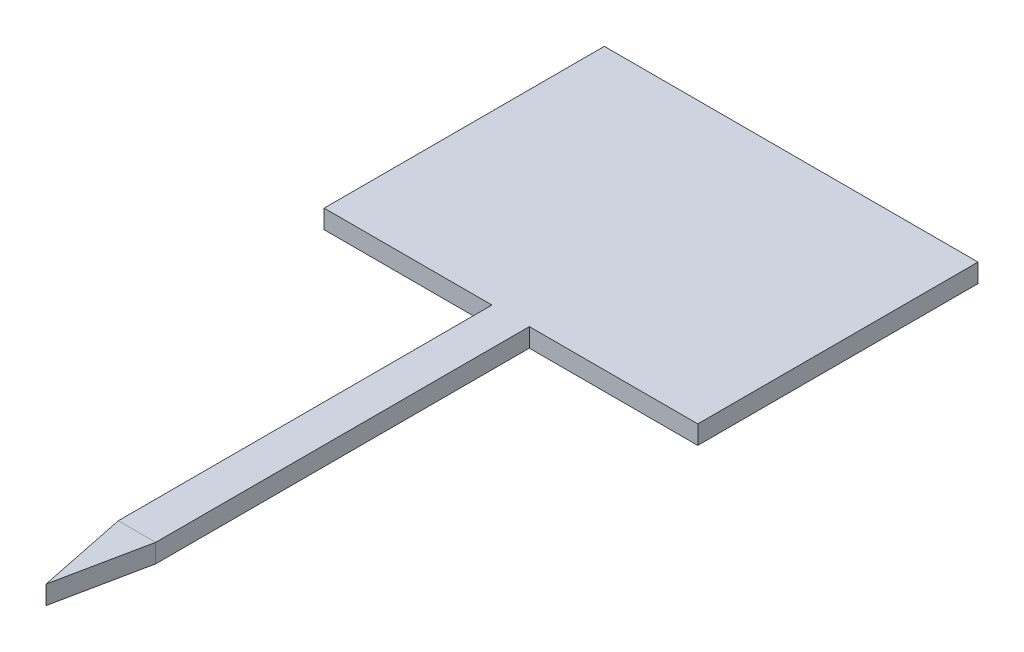
ISO-10303-21;
HEADER;
FILE_DESCRIPTION(('STEP AP214'),'2;1');
FILE_NAME('part.step','',(''),(''),'','','');
FILE_SCHEMA(('AUTOMOTIVE_DESIGN { 1 0 10303 214 1 1 1 1 }'));
ENDSEC;
DATA;
#1=APPLICATION_CONTEXT('core data for automotive mechanical design processes');
#2=APPLICATION_PROTOCOL_DEFINITION('international standard','automotive_design',2000,#1);
#3=PRODUCT_CONTEXT('',#1,'mechanical');
#4=PRODUCT('Part','Part','',(#3));
#5=PRODUCT_RELATED_PRODUCT_CATEGORY('part','',(#4));
#6=PRODUCT_DEFINITION_FORMATION('','',#4);
#7=PRODUCT_DEFINITION_CONTEXT('part definition',#1,'design');
#8=PRODUCT_DEFINITION('design','',#6,#7);
#9=PRODUCT_DEFINITION_SHAPE('','',#8);
#10=(LENGTH_UNIT() NAMED_UNIT(*) SI_UNIT(.MILLI.,.METRE.));
#11=(NAMED_UNIT(*) PLANE_ANGLE_UNIT() SI_UNIT($,.RADIAN.));
#12=(NAMED_UNIT(*) SI_UNIT($,.STERADIAN.) SOLID_ANGLE_UNIT());
#13=UNCERTAINTY_MEASURE_WITH_UNIT(LENGTH_MEASURE(1.E-05),#10,'distance_accuracy_value','');
#14=(GEOMETRIC_REPRESENTATION_CONTEXT(3) GLOBAL_UNCERTAINTY_ASSIGNED_CONTEXT((#13)) GLOBAL_UNIT_ASSIGNED_CONTEXT((#10,
#11,#12)) REPRESENTATION_CONTEXT('',''));
#15=CARTESIAN_POINT('',(0.,0.,0.));
#16=DIRECTION('',(0.,0.,1.));
#17=DIRECTION('',(1.,0.,0.));
#18=AXIS2_PLACEMENT_3D('',#15,#16,#17);
#19=CARTESIAN_POINT('',(3.576311416631,0.2,0.));
#20=DIRECTION('',(1.,0.,0.));
#21=DIRECTION('',(0.,0.,-1.));
#22=AXIS2_PLACEMENT_3D('',#19,#20,#21);
#23=PLANE('',#22);
#24=DIRECTION('',(0.,0.,1.));
#25=VECTOR('',#24,1.);
#26=CARTESIAN_POINT('',(3.576311416631,0.,0.));
#27=LINE('',#26,#25);
#28=CARTESIAN_POINT('',(3.576311416631,0.,-0.67866655363602));
#29=VERTEX_POINT('',#28);
#30=CARTESIAN_POINT('',(3.576311416631,0.,3.32133344636398));
#31=VERTEX_POINT('',#30);
#32=EDGE_CURVE('E171',#29,#31,#27,.T.);
#33=ORIENTED_EDGE('',*,*,#32,.F.);
#34=DIRECTION('',(0.,-1.,0.));
#35=VECTOR('',#34,1.);
#36=CARTESIAN_POINT('',(3.576311416631,0.2,-0.67866655363602));
#37=LINE('',#36,#35);
#38=CARTESIAN_POINT('',(3.576311416631,0.2,-0.67866655363602));
#39=VERTEX_POINT('',#38);
#40=EDGE_CURVE('E11',#39,#29,#37,.T.);
#41=ORIENTED_EDGE('',*,*,#40,.F.);
#42=DIRECTION('',(0.,0.,1.));
#43=VECTOR('',#42,1.);
#44=CARTESIAN_POINT('',(3.576311416631,0.2,0.));
#45=LINE('',#44,#43);
#46=CARTESIAN_POINT('',(3.576311416631,0.200006,3.32133344636398));
#47=VERTEX_POINT('',#46);
#48=EDGE_CURVE('E142',#39,#47,#45,.T.);
#49=ORIENTED_EDGE('',*,*,#48,.T.);
#50=DIRECTION('',(0.,-1.,0.));
#51=VECTOR('',#50,1.);
#52=CARTESIAN_POINT('',(3.576311416631,0.2,3.32133344636398));
#53=LINE('',#52,#51);
#54=EDGE_CURVE('E86',#47,#31,#53,.T.);
#55=ORIENTED_EDGE('',*,*,#54,.T.);
#56=EDGE_LOOP('',(#33,#41,#49,#55));
#57=FACE_BOUND('',#56,.T.);
#58=ADVANCED_FACE('F34',(#57),#23,.T.);
#59=CARTESIAN_POINT('',(0.,0.2,-0.67866655363602));
#60=DIRECTION('',(0.,0.,-1.));
#61=DIRECTION('',(-1.,0.,0.));
#62=AXIS2_PLACEMENT_3D('',#59,#60,#61);
#63=PLANE('',#62);
#64=DIRECTION('',(1.,0.,0.));
#65=VECTOR('',#64,1.);
#66=CARTESIAN_POINT('',(0.,0.,-0.67866655363602));
#67=LINE('',#66,#65);
#68=CARTESIAN_POINT('',(5.37970182258057,0.,-0.67866655363602));
#69=VERTEX_POINT('',#68);
#70=EDGE_CURVE('E148',#29,#69,#67,.T.);
#71=ORIENTED_EDGE('',*,*,#70,.T.);
#72=DIRECTION('',(0.,-1.,0.));
#73=VECTOR('',#72,1.);
#74=CARTESIAN_POINT('',(5.37970182258057,0.2,-0.67866655363602));
#75=LINE('',#74,#73);
#76=CARTESIAN_POINT('',(5.37970182258057,0.2,-0.67866655363602));
#77=VERTEX_POINT('',#76);
#78=EDGE_CURVE('E43',#77,#69,#75,.T.);
#79=ORIENTED_EDGE('',*,*,#78,.F.);
#80=DIRECTION('',(1.,0.,0.));
#81=VECTOR('',#80,1.);
#82=CARTESIAN_POINT('',(0.,0.2,-0.67866655363602));
#83=LINE('',#82,#81);
#84=EDGE_CURVE('E118',#39,#77,#83,.T.);
#85=ORIENTED_EDGE('',*,*,#84,.F.);
#86=ORIENTED_EDGE('',*,*,#40,.T.);
#87=EDGE_LOOP('',(#71,#79,#85,#86));
#88=FACE_BOUND('',#87,.T.);
#89=ADVANCED_FACE('F169',(#88),#63,.F.);
#90=CARTESIAN_POINT('',(5.37970182258057,0.2,0.));
#91=DIRECTION('',(1.,0.,0.));
#92=DIRECTION('',(0.,0.,-1.));
#93=AXIS2_PLACEMENT_3D('',#90,#91,#92);
#94=PLANE('',#93);
#95=DIRECTION('',(0.,0.,1.));
#96=VECTOR('',#95,1.);
#97=CARTESIAN_POINT('',(5.37970182258057,0.,0.));
#98=LINE('',#97,#96);
#99=CARTESIAN_POINT('',(5.37970182258057,0.,-3.67866655363602));
#100=VERTEX_POINT('',#99);
#101=EDGE_CURVE('E164',#100,#69,#98,.T.);
#102=ORIENTED_EDGE('',*,*,#101,.F.);
#103=DIRECTION('',(0.,-1.,0.));
#104=VECTOR('',#103,1.);
#105=CARTESIAN_POINT('',(5.37970182258057,0.2,-3.67866655363602));
#106=LINE('',#105,#104);
#107=CARTESIAN_POINT('',(5.37970182258057,0.2,-3.67866655363602));
#108=VERTEX_POINT('',#107);
#109=EDGE_CURVE('E155',#108,#100,#106,.T.);
#110=ORIENTED_EDGE('',*,*,#109,.F.);
#111=DIRECTION('',(0.,0.,1.));
#112=VECTOR('',#111,1.);
#113=CARTESIAN_POINT('',(5.37970182258057,0.2,0.));
#114=LINE('',#113,#112);
#115=EDGE_CURVE('E144',#108,#77,#114,.T.);
#116=ORIENTED_EDGE('',*,*,#115,.T.);
#117=ORIENTED_EDGE('',*,*,#78,.T.);
#118=EDGE_LOOP('',(#102,#110,#116,#117));
#119=FACE_BOUND('',#118,.T.);
#120=ADVANCED_FACE('F162',(#119),#94,.T.);
#121=CARTESIAN_POINT('',(0.,0.2,-3.67866655363602));
#122=DIRECTION('',(0.,0.,-1.));
#123=DIRECTION('',(-1.,0.,0.));
#124=AXIS2_PLACEMENT_3D('',#121,#122,#123);
#125=PLANE('',#124);
#126=DIRECTION('',(1.,0.,0.));
#127=VECTOR('',#126,1.);
#128=CARTESIAN_POINT('',(0.,0.,-3.67866655363602));
#129=LINE('',#128,#127);
#130=CARTESIAN_POINT('',(1.37970182258057,0.,-3.67866655363602));
#131=VERTEX_POINT('',#130);
#132=EDGE_CURVE('E175',#131,#100,#129,.T.);
#133=ORIENTED_EDGE('',*,*,#132,.F.);
#134=DIRECTION('',(0.,-1.,0.));
#135=VECTOR('',#134,1.);
#136=CARTESIAN_POINT('',(1.37970182258057,0.2,-3.67866655363602));
#137=LINE('',#136,#135);
#138=CARTESIAN_POINT('',(1.37970182258057,0.2,-3.67866655363602));
#139=VERTEX_POINT('',#138);
#140=EDGE_CURVE('E153',#139,#131,#137,.T.);
#141=ORIENTED_EDGE('',*,*,#140,.F.);
#142=DIRECTION('',(1.,0.,0.));
#143=VECTOR('',#142,1.);
#144=CARTESIAN_POINT('',(0.,0.2,-3.67866655363602));
#145=LINE('',#144,#143);
#146=EDGE_CURVE('E181',#139,#108,#145,.T.);
#147=ORIENTED_EDGE('',*,*,#146,.T.);
#148=ORIENTED_EDGE('',*,*,#109,.T.);
#149=EDGE_LOOP('',(#133,#141,#147,#148));
#150=FACE_BOUND('',#149,.T.);
#151=ADVANCED_FACE('F219',(#150),#125,.T.);
#152=CARTESIAN_POINT('',(1.37970182258057,0.2,0.));
#153=DIRECTION('',(1.,0.,0.));
#154=DIRECTION('',(0.,0.,-1.));
#155=AXIS2_PLACEMENT_3D('',#152,#153,#154);
#156=PLANE('',#155);
#157=DIRECTION('',(0.,0.,1.));
#158=VECTOR('',#157,1.);
#159=CARTESIAN_POINT('',(1.37970182258057,0.,0.));
#160=LINE('',#159,#158);
#161=CARTESIAN_POINT('',(1.37970182258057,0.,-0.67866655363602));
#162=VERTEX_POINT('',#161);
#163=EDGE_CURVE('E146',#131,#162,#160,.T.);
#164=ORIENTED_EDGE('',*,*,#163,.T.);
#165=DIRECTION('',(0.,-1.,0.));
#166=VECTOR('',#165,1.);
#167=CARTESIAN_POINT('',(1.37970182258057,0.2,-0.67866655363602));
#168=LINE('',#167,#166);
#169=CARTESIAN_POINT('',(1.37970182258057,0.2,-0.67866655363602));
#170=VERTEX_POINT('',#169);
#171=EDGE_CURVE('E124',#170,#162,#168,.T.);
#172=ORIENTED_EDGE('',*,*,#171,.F.);
#173=DIRECTION('',(0.,0.,1.));
#174=VECTOR('',#173,1.);
#175=CARTESIAN_POINT('',(1.37970182258057,0.2,0.));
#176=LINE('',#175,#174);
#177=EDGE_CURVE('E115',#139,#170,#176,.T.);
#178=ORIENTED_EDGE('',*,*,#177,.F.);
#179=ORIENTED_EDGE('',*,*,#140,.T.);
#180=EDGE_LOOP('',(#164,#172,#178,#179));
#181=FACE_BOUND('',#180,.T.);
#182=ADVANCED_FACE('F216',(#181),#156,.F.);
#183=CARTESIAN_POINT('',(3.17631141663099,0.,-0.67866655363602));
#184=VERTEX_POINT('',#183);
#185=EDGE_CURVE('E79',#162,#184,#67,.T.);
#186=ORIENTED_EDGE('',*,*,#185,.T.);
#187=DIRECTION('',(0.,-1.,0.));
#188=VECTOR('',#187,1.);
#189=CARTESIAN_POINT('',(3.17631141663099,0.2,-0.67866655363602));
#190=LINE('',#189,#188);
#191=CARTESIAN_POINT('',(3.17631141663099,0.2,-0.67866655363602));
#192=VERTEX_POINT('',#191);
#193=EDGE_CURVE('E119',#192,#184,#190,.T.);
#194=ORIENTED_EDGE('',*,*,#193,.F.);
#195=EDGE_CURVE('E108',#170,#192,#83,.T.);
#196=ORIENTED_EDGE('',*,*,#195,.F.);
#197=ORIENTED_EDGE('',*,*,#171,.T.);
#198=EDGE_LOOP('',(#186,#194,#196,#197));
#199=FACE_BOUND('',#198,.T.);
#200=ADVANCED_FACE('F120',(#199),#63,.F.);
#201=CARTESIAN_POINT('',(3.17631141663099,0.2,0.));
#202=DIRECTION('',(1.,0.,0.));
#203=DIRECTION('',(0.,0.,-1.));
#204=AXIS2_PLACEMENT_3D('',#201,#202,#203);
#205=PLANE('',#204);
#206=DIRECTION('',(0.,0.,1.));
#207=VECTOR('',#206,1.);
#208=CARTESIAN_POINT('',(3.17631141663099,0.,0.));
#209=LINE('',#208,#207);
#210=CARTESIAN_POINT('',(3.17631141663099,0.,3.32133344636398));
#211=VERTEX_POINT('',#210);
#212=EDGE_CURVE('E143',#184,#211,#209,.T.);
#213=ORIENTED_EDGE('',*,*,#212,.T.);
#214=DIRECTION('',(0.,-1.,0.));
#215=VECTOR('',#214,1.);
#216=CARTESIAN_POINT('',(3.17631141663099,0.2,3.32133344636398));
#217=LINE('',#216,#215);
#218=CARTESIAN_POINT('',(3.17631141663099,0.200006,3.32133344636398));
#219=VERTEX_POINT('',#218);
#220=EDGE_CURVE('E125',#219,#211,#217,.T.);
#221=ORIENTED_EDGE('',*,*,#220,.F.);
#222=DIRECTION('',(0.,0.,1.));
#223=VECTOR('',#222,1.);
#224=CARTESIAN_POINT('',(3.17631141663099,0.2,0.));
#225=LINE('',#224,#223);
#226=EDGE_CURVE('E111',#192,#219,#225,.T.);
#227=ORIENTED_EDGE('',*,*,#226,.F.);
#228=ORIENTED_EDGE('',*,*,#193,.T.);
#229=EDGE_LOOP('',(#213,#221,#227,#228));
#230=FACE_BOUND('',#229,.T.);
#231=ADVANCED_FACE('F127',(#230),#205,.F.);
#232=CARTESIAN_POINT('',(0.,0.2,0.));
#233=DIRECTION('',(0.,1.,0.));
#234=DIRECTION('',(0.,0.,1.));
#235=AXIS2_PLACEMENT_3D('',#232,#233,#234);
#236=PLANE('',#235);
#237=ORIENTED_EDGE('',*,*,#48,.F.);
#238=ORIENTED_EDGE('',*,*,#84,.T.);
#239=ORIENTED_EDGE('',*,*,#115,.F.);
#240=ORIENTED_EDGE('',*,*,#146,.F.);
#241=ORIENTED_EDGE('',*,*,#177,.T.);
#242=ORIENTED_EDGE('',*,*,#195,.T.);
#243=ORIENTED_EDGE('',*,*,#226,.T.);
#244=CARTESIAN_POINT('',(3.17631141663099,0.2,3.32133344636398));
#245=DIRECTION('',(1.,0.,0.));
#246=VECTOR('',#245,1.);
#247=LINE('',#244,#246);
#248=EDGE_CURVE('E52',#219,#47,#247,.T.);
#249=ORIENTED_EDGE('',*,*,#248,.T.);
#250=EDGE_LOOP('',(#237,#238,#239,#240,#241,#242,#243,#249));
#251=FACE_BOUND('',#250,.T.);
#252=ADVANCED_FACE('F109',(#251),#236,.T.);
#253=CARTESIAN_POINT('',(0.,0.,0.));
#254=DIRECTION('',(0.,1.,0.));
#255=DIRECTION('',(0.,0.,1.));
#256=AXIS2_PLACEMENT_3D('',#253,#254,#255);
#257=PLANE('',#256);
#258=ORIENTED_EDGE('',*,*,#32,.T.);
#259=DIRECTION('',(0.201124519344517,0.,-0.979565683207837));
#260=VECTOR('',#259,1.);
#261=CARTESIAN_POINT('',(3.576311416631,0.,3.32133344636398));
#262=LINE('',#261,#260);
#263=CARTESIAN_POINT('',(3.37631141663099,0.,4.29542222121881));
#264=VERTEX_POINT('',#263);
#265=EDGE_CURVE('E234',#264,#31,#262,.T.);
#266=ORIENTED_EDGE('',*,*,#265,.F.);
#267=DIRECTION('',(0.201124519344517,0.,0.979565683207837));
#268=VECTOR('',#267,1.);
#269=CARTESIAN_POINT('',(3.37631141663099,0.,4.29542222121881));
#270=LINE('',#269,#268);
#271=EDGE_CURVE('E240',#211,#264,#270,.T.);
#272=ORIENTED_EDGE('',*,*,#271,.F.);
#273=ORIENTED_EDGE('',*,*,#212,.F.);
#274=ORIENTED_EDGE('',*,*,#185,.F.);
#275=ORIENTED_EDGE('',*,*,#163,.F.);
#276=ORIENTED_EDGE('',*,*,#132,.T.);
#277=ORIENTED_EDGE('',*,*,#101,.T.);
#278=ORIENTED_EDGE('',*,*,#70,.F.);
#279=EDGE_LOOP('',(#258,#266,#272,#273,#274,#275,#276,#277,#278));
#280=FACE_BOUND('',#279,.T.);
#281=ADVANCED_FACE('F172',(#280),#257,.F.);
#282=CARTESIAN_POINT('',(3.37631141663099,0.,4.29542222121881));
#283=DIRECTION('',(-0.979565683207837,0.,0.201124519344517));
#284=DIRECTION('',(0.201124519344517,0.,0.979565683207838));
#285=AXIS2_PLACEMENT_3D('',#282,#283,#284);
#286=PLANE('',#285);
#287=DIRECTION('',(0.,1.,0.));
#288=VECTOR('',#287,1.);
#289=CARTESIAN_POINT('',(3.37631141663099,0.,4.29542222121881));
#290=LINE('',#289,#288);
#291=CARTESIAN_POINT('',(3.37631141663099,0.2,4.29542222121881));
#292=VERTEX_POINT('',#291);
#293=EDGE_CURVE('E179',#264,#292,#290,.T.);
#294=ORIENTED_EDGE('',*,*,#293,.T.);
#295=DIRECTION('',(0.201124519344517,0.,0.979565683207837));
#296=VECTOR('',#295,1.);
#297=CARTESIAN_POINT('',(3.37631141663099,0.200012,4.29542222121881));
#298=LINE('',#297,#296);
#299=EDGE_CURVE('E249',#219,#292,#298,.T.);
#300=ORIENTED_EDGE('',*,*,#299,.F.);
#301=ORIENTED_EDGE('',*,*,#220,.T.);
#302=ORIENTED_EDGE('',*,*,#271,.T.);
#303=EDGE_LOOP('',(#294,#300,#301,#302));
#304=FACE_BOUND('',#303,.T.);
#305=ADVANCED_FACE('F203',(#304),#286,.T.);
#306=CARTESIAN_POINT('',(3.576311416631,0.,3.32133344636398));
#307=DIRECTION('',(0.979565683207837,0.,0.201124519344517));
#308=DIRECTION('',(0.201124519344517,0.,-0.979565683207838));
#309=AXIS2_PLACEMENT_3D('',#306,#307,#308);
#310=PLANE('',#309);
#311=ORIENTED_EDGE('',*,*,#54,.F.);
#312=DIRECTION('',(0.201124519344517,0.,-0.979565683207837));
#313=VECTOR('',#312,1.);
#314=CARTESIAN_POINT('',(3.576311416631,0.200012,3.32133344636398));
#315=LINE('',#314,#313);
#316=EDGE_CURVE('E243',#292,#47,#315,.T.);
#317=ORIENTED_EDGE('',*,*,#316,.F.);
#318=ORIENTED_EDGE('',*,*,#293,.F.);
#319=ORIENTED_EDGE('',*,*,#265,.T.);
#320=EDGE_LOOP('',(#311,#317,#318,#319));
#321=FACE_BOUND('',#320,.T.);
#322=ADVANCED_FACE('F199',(#321),#310,.T.);
#323=CARTESIAN_POINT('',(0.,0.200012,0.));
#324=DIRECTION('',(0.,-1.,0.));
#325=DIRECTION('',(0.,0.,-1.));
#326=AXIS2_PLACEMENT_3D('',#323,#324,#325);
#327=PLANE('',#326);
#328=ORIENTED_EDGE('',*,*,#299,.T.);
#329=ORIENTED_EDGE('',*,*,#316,.T.);
#330=ORIENTED_EDGE('',*,*,#248,.F.);
#331=EDGE_LOOP('',(#328,#329,#330));
#332=FACE_BOUND('',#331,.T.);
#333=ADVANCED_FACE('F190',(#332),#327,.F.);
#334=CLOSED_SHELL('',(#58,#89,#120,#151,#182,#200,#231,#252,#281,#305,#322,#333));
#335=MANIFOLD_SOLID_BREP('B2',#334);
#336=ADVANCED_BREP_SHAPE_REPRESENTATION('',(#18,#335),#14);
#337=SHAPE_DEFINITION_REPRESENTATION(#9,#336);
ENDSEC;
END-ISO-10303-21;
